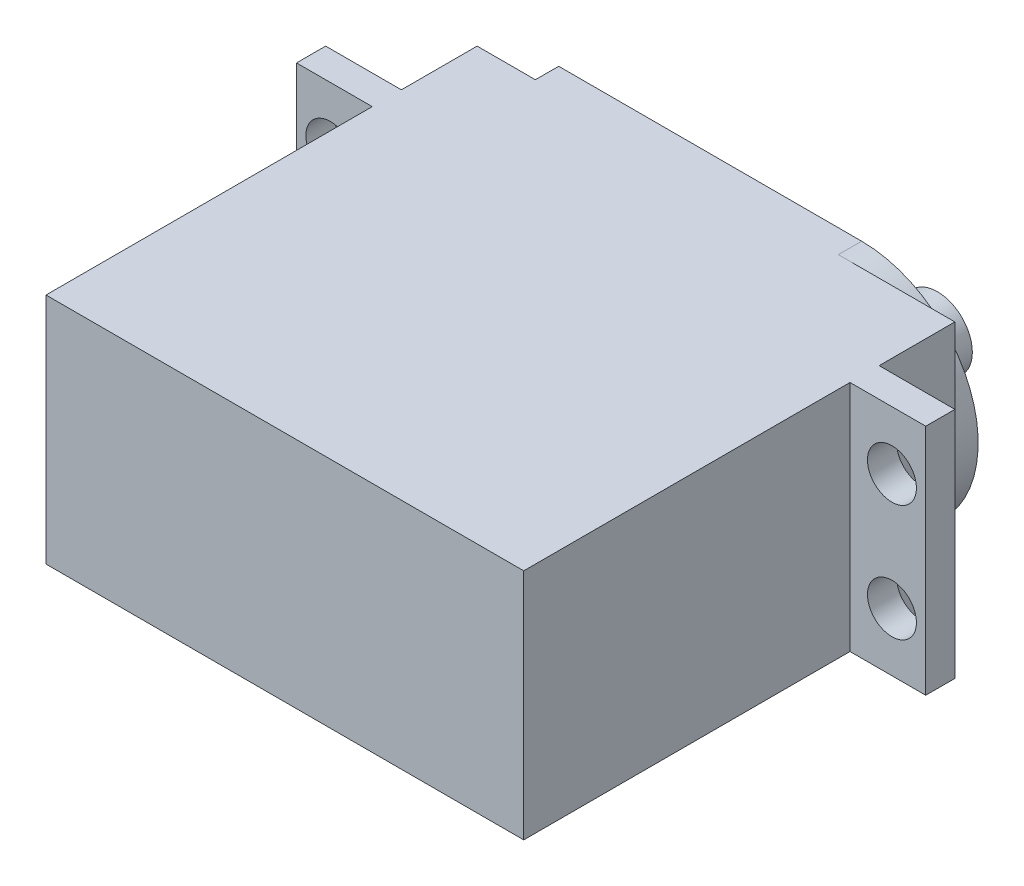
ISO-10303-21;
HEADER;
FILE_DESCRIPTION(('STEP AP214'),'2;1');
FILE_NAME('part.step','',(''),(''),'','','');
FILE_SCHEMA(('AUTOMOTIVE_DESIGN { 1 0 10303 214 1 1 1 1 }'));
ENDSEC;
DATA;
#1=APPLICATION_CONTEXT('core data for automotive mechanical design processes');
#2=APPLICATION_PROTOCOL_DEFINITION('international standard','automotive_design',2000,#1);
#3=PRODUCT_CONTEXT('',#1,'mechanical');
#4=PRODUCT('Part','Part','',(#3));
#5=PRODUCT_RELATED_PRODUCT_CATEGORY('part','',(#4));
#6=PRODUCT_DEFINITION_FORMATION('','',#4);
#7=PRODUCT_DEFINITION_CONTEXT('part definition',#1,'design');
#8=PRODUCT_DEFINITION('design','',#6,#7);
#9=PRODUCT_DEFINITION_SHAPE('','',#8);
#10=(LENGTH_UNIT() NAMED_UNIT(*) SI_UNIT(.MILLI.,.METRE.));
#11=(NAMED_UNIT(*) PLANE_ANGLE_UNIT() SI_UNIT($,.RADIAN.));
#12=(NAMED_UNIT(*) SI_UNIT($,.STERADIAN.) SOLID_ANGLE_UNIT());
#13=UNCERTAINTY_MEASURE_WITH_UNIT(LENGTH_MEASURE(1.E-05),#10,'distance_accuracy_value','');
#14=(GEOMETRIC_REPRESENTATION_CONTEXT(3) GLOBAL_UNCERTAINTY_ASSIGNED_CONTEXT((#13)) GLOBAL_UNIT_ASSIGNED_CONTEXT((#10,
#11,#12)) REPRESENTATION_CONTEXT('',''));
#15=CARTESIAN_POINT('',(0.,0.,0.));
#16=DIRECTION('',(0.,0.,1.));
#17=DIRECTION('',(1.,0.,0.));
#18=AXIS2_PLACEMENT_3D('',#15,#16,#17);
#19=CARTESIAN_POINT('',(10.5,-40.,-13.4999999999999));
#20=DIRECTION('',(0.,0.,1.));
#21=DIRECTION('',(1.,0.,0.));
#22=AXIS2_PLACEMENT_3D('',#19,#20,#21);
#23=PLANE('',#22);
#24=DIRECTION('',(1.,0.,0.));
#25=VECTOR('',#24,1.);
#26=CARTESIAN_POINT('',(10.5,-30.,-13.4999999999999));
#27=LINE('',#26,#25);
#28=CARTESIAN_POINT('',(10.5,-30.,-13.4999999999999));
#29=VERTEX_POINT('',#28);
#30=CARTESIAN_POINT('',(20.5,-30.,-13.4999999999999));
#31=VERTEX_POINT('',#30);
#32=EDGE_CURVE('E181',#29,#31,#27,.T.);
#33=ORIENTED_EDGE('',*,*,#32,.T.);
#34=DIRECTION('',(0.,-1.,0.));
#35=VECTOR('',#34,1.);
#36=CARTESIAN_POINT('',(20.5,-40.,-13.4999999999999));
#37=LINE('',#36,#35);
#38=CARTESIAN_POINT('',(20.5,-40.,-13.4999999999999));
#39=VERTEX_POINT('',#38);
#40=EDGE_CURVE('E40',#31,#39,#37,.T.);
#41=ORIENTED_EDGE('',*,*,#40,.T.);
#42=CARTESIAN_POINT('',(10.5,-40.,-13.4999999999999));
#43=DIRECTION('',(0.,0.,1.));
#44=DIRECTION('',(1.,0.,0.));
#45=AXIS2_PLACEMENT_3D('',#42,#43,#44);
#46=CIRCLE('',#45,10.);
#47=EDGE_CURVE('E182',#39,#29,#46,.T.);
#48=ORIENTED_EDGE('',*,*,#47,.T.);
#49=EDGE_LOOP('',(#33,#41,#48));
#50=FACE_BOUND('',#49,.T.);
#51=ADVANCED_FACE('F32',(#50),#23,.F.);
#52=CARTESIAN_POINT('',(0.,-30.,0.));
#53=DIRECTION('',(0.,-1.,0.));
#54=DIRECTION('',(0.,0.,-1.));
#55=AXIS2_PLACEMENT_3D('',#52,#53,#54);
#56=PLANE('',#55);
#57=DIRECTION('',(0.,0.,1.));
#58=VECTOR('',#57,1.);
#59=CARTESIAN_POINT('',(27.,-30.,-15.4999999999999));
#60=LINE('',#59,#58);
#61=CARTESIAN_POINT('',(27.,-30.,-6.99999999999995));
#62=VERTEX_POINT('',#61);
#63=CARTESIAN_POINT('',(27.,-30.,-4.49999999999995));
#64=VERTEX_POINT('',#63);
#65=EDGE_CURVE('E265',#62,#64,#60,.T.);
#66=ORIENTED_EDGE('',*,*,#65,.F.);
#67=DIRECTION('',(1.,0.,0.));
#68=VECTOR('',#67,1.);
#69=CARTESIAN_POINT('',(20.5,-30.,-6.99999999999995));
#70=LINE('',#69,#68);
#71=CARTESIAN_POINT('',(20.5,-30.,-6.99999999999995));
#72=VERTEX_POINT('',#71);
#73=EDGE_CURVE('E167',#72,#62,#70,.T.);
#74=ORIENTED_EDGE('',*,*,#73,.F.);
#75=DIRECTION('',(0.,0.,1.));
#76=VECTOR('',#75,1.);
#77=CARTESIAN_POINT('',(20.5,-30.,-13.4999999999999));
#78=LINE('',#77,#76);
#79=EDGE_CURVE('E150',#31,#72,#78,.T.);
#80=ORIENTED_EDGE('',*,*,#79,.F.);
#81=ORIENTED_EDGE('',*,*,#32,.F.);
#82=DIRECTION('',(0.,0.,-1.));
#83=VECTOR('',#82,1.);
#84=CARTESIAN_POINT('',(10.5,-30.,-13.4999999999999));
#85=LINE('',#84,#83);
#86=CARTESIAN_POINT('',(10.5,-30.,-15.4999999999999));
#87=VERTEX_POINT('',#86);
#88=EDGE_CURVE('E186',#29,#87,#85,.T.);
#89=ORIENTED_EDGE('',*,*,#88,.T.);
#90=DIRECTION('',(1.,0.,0.));
#91=VECTOR('',#90,1.);
#92=CARTESIAN_POINT('',(-27.,-30.,-15.4999999999999));
#93=LINE('',#92,#91);
#94=CARTESIAN_POINT('',(-15.5,-30.,-15.4999999999999));
#95=VERTEX_POINT('',#94);
#96=EDGE_CURVE('E262',#95,#87,#93,.T.);
#97=ORIENTED_EDGE('',*,*,#96,.F.);
#98=DIRECTION('',(0.,0.,-1.));
#99=VECTOR('',#98,1.);
#100=CARTESIAN_POINT('',(-15.5,-30.,-13.4999999999999));
#101=LINE('',#100,#99);
#102=CARTESIAN_POINT('',(-15.5,-30.,-13.4999999999999));
#103=VERTEX_POINT('',#102);
#104=EDGE_CURVE('E195',#103,#95,#101,.T.);
#105=ORIENTED_EDGE('',*,*,#104,.F.);
#106=DIRECTION('',(1.,0.,0.));
#107=VECTOR('',#106,1.);
#108=CARTESIAN_POINT('',(-20.5,-30.,-13.4999999999999));
#109=LINE('',#108,#107);
#110=CARTESIAN_POINT('',(-20.5,-30.,-13.4999999999999));
#111=VERTEX_POINT('',#110);
#112=EDGE_CURVE('E190',#111,#103,#109,.T.);
#113=ORIENTED_EDGE('',*,*,#112,.F.);
#114=DIRECTION('',(0.,0.,-1.));
#115=VECTOR('',#114,1.);
#116=CARTESIAN_POINT('',(-20.5,-30.,-6.99999999999995));
#117=LINE('',#116,#115);
#118=CARTESIAN_POINT('',(-20.5,-30.,-6.99999999999995));
#119=VERTEX_POINT('',#118);
#120=EDGE_CURVE('E213',#119,#111,#117,.T.);
#121=ORIENTED_EDGE('',*,*,#120,.F.);
#122=DIRECTION('',(1.,0.,0.));
#123=VECTOR('',#122,1.);
#124=CARTESIAN_POINT('',(-27.,-30.,-6.99999999999995));
#125=LINE('',#124,#123);
#126=CARTESIAN_POINT('',(-27.,-30.,-6.99999999999995));
#127=VERTEX_POINT('',#126);
#128=EDGE_CURVE('E205',#127,#119,#125,.T.);
#129=ORIENTED_EDGE('',*,*,#128,.F.);
#130=DIRECTION('',(0.,0.,-1.));
#131=VECTOR('',#130,1.);
#132=CARTESIAN_POINT('',(-27.,-30.,23.5000000000001));
#133=LINE('',#132,#131);
#134=CARTESIAN_POINT('',(-27.,-30.,-4.49999999999995));
#135=VERTEX_POINT('',#134);
#136=EDGE_CURVE('E271',#135,#127,#133,.T.);
#137=ORIENTED_EDGE('',*,*,#136,.F.);
#138=DIRECTION('',(-1.,0.,0.));
#139=VECTOR('',#138,1.);
#140=CARTESIAN_POINT('',(-20.5,-30.,-4.49999999999995));
#141=LINE('',#140,#139);
#142=CARTESIAN_POINT('',(-20.5,-30.,-4.49999999999995));
#143=VERTEX_POINT('',#142);
#144=EDGE_CURVE('E229',#143,#135,#141,.T.);
#145=ORIENTED_EDGE('',*,*,#144,.F.);
#146=DIRECTION('',(0.,0.,-1.));
#147=VECTOR('',#146,1.);
#148=CARTESIAN_POINT('',(-20.5,-30.,23.5000000000001));
#149=LINE('',#148,#147);
#150=CARTESIAN_POINT('',(-20.5,-30.,23.5000000000001));
#151=VERTEX_POINT('',#150);
#152=EDGE_CURVE('E223',#151,#143,#149,.T.);
#153=ORIENTED_EDGE('',*,*,#152,.F.);
#154=DIRECTION('',(-1.,0.,0.));
#155=VECTOR('',#154,1.);
#156=CARTESIAN_POINT('',(27.,-30.,23.5000000000001));
#157=LINE('',#156,#155);
#158=CARTESIAN_POINT('',(20.5,-30.,23.5000000000001));
#159=VERTEX_POINT('',#158);
#160=EDGE_CURVE('E268',#159,#151,#157,.T.);
#161=ORIENTED_EDGE('',*,*,#160,.F.);
#162=DIRECTION('',(0.,0.,1.));
#163=VECTOR('',#162,1.);
#164=CARTESIAN_POINT('',(20.5,-30.,-4.49999999999995));
#165=LINE('',#164,#163);
#166=CARTESIAN_POINT('',(20.5,-30.,-4.49999999999995));
#167=VERTEX_POINT('',#166);
#168=EDGE_CURVE('E247',#167,#159,#165,.T.);
#169=ORIENTED_EDGE('',*,*,#168,.F.);
#170=DIRECTION('',(-1.,0.,0.));
#171=VECTOR('',#170,1.);
#172=CARTESIAN_POINT('',(27.,-30.,-4.49999999999995));
#173=LINE('',#172,#171);
#174=EDGE_CURVE('E239',#64,#167,#173,.T.);
#175=ORIENTED_EDGE('',*,*,#174,.F.);
#176=EDGE_LOOP('',(#66,#74,#80,#81,#89,#97,#105,#113,#121,#129,#137,#145,#153,#161,#169,#175));
#177=FACE_BOUND('',#176,.T.);
#178=ADVANCED_FACE('F304',(#177),#56,.F.);
#179=CARTESIAN_POINT('',(0.,-50.,0.));
#180=DIRECTION('',(0.,-1.,0.));
#181=DIRECTION('',(0.,0.,-1.));
#182=AXIS2_PLACEMENT_3D('',#179,#180,#181);
#183=PLANE('',#182);
#184=DIRECTION('',(1.,0.,0.));
#185=VECTOR('',#184,1.);
#186=CARTESIAN_POINT('',(20.5,-50.,-6.99999999999995));
#187=LINE('',#186,#185);
#188=CARTESIAN_POINT('',(20.5,-50.,-6.99999999999995));
#189=VERTEX_POINT('',#188);
#190=CARTESIAN_POINT('',(27.,-50.,-6.99999999999995));
#191=VERTEX_POINT('',#190);
#192=EDGE_CURVE('E157',#189,#191,#187,.T.);
#193=ORIENTED_EDGE('',*,*,#192,.T.);
#194=DIRECTION('',(0.,0.,1.));
#195=VECTOR('',#194,1.);
#196=CARTESIAN_POINT('',(27.,-50.,-15.4999999999999));
#197=LINE('',#196,#195);
#198=CARTESIAN_POINT('',(27.,-50.,-4.49999999999995));
#199=VERTEX_POINT('',#198);
#200=EDGE_CURVE('E276',#191,#199,#197,.T.);
#201=ORIENTED_EDGE('',*,*,#200,.T.);
#202=DIRECTION('',(-1.,0.,0.));
#203=VECTOR('',#202,1.);
#204=CARTESIAN_POINT('',(27.,-50.,-4.49999999999995));
#205=LINE('',#204,#203);
#206=CARTESIAN_POINT('',(20.5,-50.,-4.49999999999995));
#207=VERTEX_POINT('',#206);
#208=EDGE_CURVE('E243',#199,#207,#205,.T.);
#209=ORIENTED_EDGE('',*,*,#208,.T.);
#210=DIRECTION('',(0.,0.,1.));
#211=VECTOR('',#210,1.);
#212=CARTESIAN_POINT('',(20.5,-50.,-4.49999999999995));
#213=LINE('',#212,#211);
#214=CARTESIAN_POINT('',(20.5,-50.,23.5000000000001));
#215=VERTEX_POINT('',#214);
#216=EDGE_CURVE('E246',#207,#215,#213,.T.);
#217=ORIENTED_EDGE('',*,*,#216,.T.);
#218=DIRECTION('',(-1.,0.,0.));
#219=VECTOR('',#218,1.);
#220=CARTESIAN_POINT('',(27.,-50.,23.5000000000001));
#221=LINE('',#220,#219);
#222=CARTESIAN_POINT('',(-20.5,-50.,23.5000000000001));
#223=VERTEX_POINT('',#222);
#224=EDGE_CURVE('E278',#215,#223,#221,.T.);
#225=ORIENTED_EDGE('',*,*,#224,.T.);
#226=DIRECTION('',(0.,0.,-1.));
#227=VECTOR('',#226,1.);
#228=CARTESIAN_POINT('',(-20.5,-50.,23.5000000000001));
#229=LINE('',#228,#227);
#230=CARTESIAN_POINT('',(-20.5,-50.,-4.49999999999995));
#231=VERTEX_POINT('',#230);
#232=EDGE_CURVE('E225',#223,#231,#229,.T.);
#233=ORIENTED_EDGE('',*,*,#232,.T.);
#234=DIRECTION('',(-1.,0.,0.));
#235=VECTOR('',#234,1.);
#236=CARTESIAN_POINT('',(-20.5,-50.,-4.49999999999995));
#237=LINE('',#236,#235);
#238=CARTESIAN_POINT('',(-27.,-50.,-4.49999999999995));
#239=VERTEX_POINT('',#238);
#240=EDGE_CURVE('E228',#231,#239,#237,.T.);
#241=ORIENTED_EDGE('',*,*,#240,.T.);
#242=DIRECTION('',(0.,0.,-1.));
#243=VECTOR('',#242,1.);
#244=CARTESIAN_POINT('',(-27.,-50.,23.5000000000001));
#245=LINE('',#244,#243);
#246=CARTESIAN_POINT('',(-27.,-50.,-6.99999999999995));
#247=VERTEX_POINT('',#246);
#248=EDGE_CURVE('E266',#239,#247,#245,.T.);
#249=ORIENTED_EDGE('',*,*,#248,.T.);
#250=DIRECTION('',(1.,0.,0.));
#251=VECTOR('',#250,1.);
#252=CARTESIAN_POINT('',(-27.,-50.,-6.99999999999995));
#253=LINE('',#252,#251);
#254=CARTESIAN_POINT('',(-20.5,-50.,-6.99999999999995));
#255=VERTEX_POINT('',#254);
#256=EDGE_CURVE('E209',#247,#255,#253,.T.);
#257=ORIENTED_EDGE('',*,*,#256,.T.);
#258=DIRECTION('',(0.,0.,-1.));
#259=VECTOR('',#258,1.);
#260=CARTESIAN_POINT('',(-20.5,-50.,-6.99999999999995));
#261=LINE('',#260,#259);
#262=CARTESIAN_POINT('',(-20.5,-50.,-13.4999999999999));
#263=VERTEX_POINT('',#262);
#264=EDGE_CURVE('E212',#255,#263,#261,.T.);
#265=ORIENTED_EDGE('',*,*,#264,.T.);
#266=DIRECTION('',(1.,0.,0.));
#267=VECTOR('',#266,1.);
#268=CARTESIAN_POINT('',(-20.5,-50.,-13.4999999999999));
#269=LINE('',#268,#267);
#270=CARTESIAN_POINT('',(-15.5,-50.,-13.4999999999999));
#271=VERTEX_POINT('',#270);
#272=EDGE_CURVE('E55',#263,#271,#269,.T.);
#273=ORIENTED_EDGE('',*,*,#272,.T.);
#274=DIRECTION('',(0.,0.,-1.));
#275=VECTOR('',#274,1.);
#276=CARTESIAN_POINT('',(-15.5,-50.,-13.4999999999999));
#277=LINE('',#276,#275);
#278=CARTESIAN_POINT('',(-15.5,-50.,-15.4999999999999));
#279=VERTEX_POINT('',#278);
#280=EDGE_CURVE('E194',#271,#279,#277,.T.);
#281=ORIENTED_EDGE('',*,*,#280,.T.);
#282=DIRECTION('',(1.,0.,0.));
#283=VECTOR('',#282,1.);
#284=CARTESIAN_POINT('',(-27.,-50.,-15.4999999999999));
#285=LINE('',#284,#283);
#286=CARTESIAN_POINT('',(10.5,-50.,-15.4999999999999));
#287=VERTEX_POINT('',#286);
#288=EDGE_CURVE('E257',#279,#287,#285,.T.);
#289=ORIENTED_EDGE('',*,*,#288,.T.);
#290=DIRECTION('',(0.,0.,-1.));
#291=VECTOR('',#290,1.);
#292=CARTESIAN_POINT('',(10.5,-50.,-13.4999999999999));
#293=LINE('',#292,#291);
#294=CARTESIAN_POINT('',(10.5,-50.,-13.4999999999999));
#295=VERTEX_POINT('',#294);
#296=EDGE_CURVE('E188',#295,#287,#293,.T.);
#297=ORIENTED_EDGE('',*,*,#296,.F.);
#298=DIRECTION('',(-1.,0.,0.));
#299=VECTOR('',#298,1.);
#300=CARTESIAN_POINT('',(27.,-50.,-13.4999999999999));
#301=LINE('',#300,#299);
#302=CARTESIAN_POINT('',(20.5,-50.,-13.4999999999999));
#303=VERTEX_POINT('',#302);
#304=EDGE_CURVE('E166',#303,#295,#301,.T.);
#305=ORIENTED_EDGE('',*,*,#304,.F.);
#306=DIRECTION('',(0.,0.,1.));
#307=VECTOR('',#306,1.);
#308=CARTESIAN_POINT('',(20.5,-50.,-13.4999999999999));
#309=LINE('',#308,#307);
#310=EDGE_CURVE('E47',#303,#189,#309,.T.);
#311=ORIENTED_EDGE('',*,*,#310,.T.);
#312=EDGE_LOOP('',(#193,#201,#209,#217,#225,#233,#241,#249,#257,#265,#273,#281,#289,#297,#305,#311));
#313=FACE_BOUND('',#312,.T.);
#314=ADVANCED_FACE('F164',(#313),#183,.T.);
#315=CARTESIAN_POINT('',(-27.,-30.,-15.4999999999999));
#316=DIRECTION('',(0.,0.,-1.));
#317=DIRECTION('',(-1.,0.,0.));
#318=AXIS2_PLACEMENT_3D('',#315,#316,#317);
#319=PLANE('',#318);
#320=CARTESIAN_POINT('',(10.5,-40.,-15.4999999999999));
#321=DIRECTION('',(0.,0.,-1.));
#322=DIRECTION('',(-1.,0.,0.));
#323=AXIS2_PLACEMENT_3D('',#320,#321,#322);
#324=CIRCLE('',#323,6.5);
#325=CARTESIAN_POINT('',(4.,-40.,-15.4999999999999));
#326=VERTEX_POINT('',#325);
#327=EDGE_CURVE('E11',#326,#326,#324,.T.);
#328=ORIENTED_EDGE('',*,*,#327,.F.);
#329=EDGE_LOOP('',(#328));
#330=FACE_BOUND('',#329,.T.);
#331=CARTESIAN_POINT('',(10.5,-40.,-15.4999999999999));
#332=DIRECTION('',(0.,0.,1.));
#333=DIRECTION('',(1.,0.,0.));
#334=AXIS2_PLACEMENT_3D('',#331,#332,#333);
#335=CIRCLE('',#334,10.);
#336=EDGE_CURVE('E175',#287,#87,#335,.T.);
#337=ORIENTED_EDGE('',*,*,#336,.F.);
#338=ORIENTED_EDGE('',*,*,#288,.F.);
#339=DIRECTION('',(0.,1.,0.));
#340=VECTOR('',#339,1.);
#341=CARTESIAN_POINT('',(-15.5,-50.,-15.4999999999999));
#342=LINE('',#341,#340);
#343=EDGE_CURVE('E202',#279,#95,#342,.T.);
#344=ORIENTED_EDGE('',*,*,#343,.T.);
#345=ORIENTED_EDGE('',*,*,#96,.T.);
#346=EDGE_LOOP('',(#337,#338,#344,#345));
#347=FACE_BOUND('',#346,.T.);
#348=ADVANCED_FACE('F34',(#330,#347),#319,.T.);
#349=CARTESIAN_POINT('',(-27.,-30.,23.5000000000001));
#350=DIRECTION('',(-1.,0.,0.));
#351=DIRECTION('',(0.,0.,1.));
#352=AXIS2_PLACEMENT_3D('',#349,#350,#351);
#353=PLANE('',#352);
#354=DIRECTION('',(0.,1.,0.));
#355=VECTOR('',#354,1.);
#356=CARTESIAN_POINT('',(-27.,-50.,-6.99999999999995));
#357=LINE('',#356,#355);
#358=EDGE_CURVE('E216',#247,#127,#357,.T.);
#359=ORIENTED_EDGE('',*,*,#358,.F.);
#360=ORIENTED_EDGE('',*,*,#248,.F.);
#361=DIRECTION('',(0.,1.,0.));
#362=VECTOR('',#361,1.);
#363=CARTESIAN_POINT('',(-27.,-50.,-4.49999999999995));
#364=LINE('',#363,#362);
#365=EDGE_CURVE('E236',#239,#135,#364,.T.);
#366=ORIENTED_EDGE('',*,*,#365,.T.);
#367=ORIENTED_EDGE('',*,*,#136,.T.);
#368=EDGE_LOOP('',(#359,#360,#366,#367));
#369=FACE_BOUND('',#368,.T.);
#370=ADVANCED_FACE('F319',(#369),#353,.T.);
#371=CARTESIAN_POINT('',(27.,-30.,23.5000000000001));
#372=DIRECTION('',(0.,0.,1.));
#373=DIRECTION('',(1.,0.,0.));
#374=AXIS2_PLACEMENT_3D('',#371,#372,#373);
#375=PLANE('',#374);
#376=DIRECTION('',(0.,1.,0.));
#377=VECTOR('',#376,1.);
#378=CARTESIAN_POINT('',(-20.5,-50.,23.5000000000001));
#379=LINE('',#378,#377);
#380=EDGE_CURVE('E232',#223,#151,#379,.T.);
#381=ORIENTED_EDGE('',*,*,#380,.F.);
#382=ORIENTED_EDGE('',*,*,#224,.F.);
#383=DIRECTION('',(0.,1.,0.));
#384=VECTOR('',#383,1.);
#385=CARTESIAN_POINT('',(20.5,-50.,23.5000000000001));
#386=LINE('',#385,#384);
#387=EDGE_CURVE('E254',#215,#159,#386,.T.);
#388=ORIENTED_EDGE('',*,*,#387,.T.);
#389=ORIENTED_EDGE('',*,*,#160,.T.);
#390=EDGE_LOOP('',(#381,#382,#388,#389));
#391=FACE_BOUND('',#390,.T.);
#392=ADVANCED_FACE('F322',(#391),#375,.T.);
#393=CARTESIAN_POINT('',(27.,-30.,-15.4999999999999));
#394=DIRECTION('',(1.,0.,0.));
#395=DIRECTION('',(0.,0.,-1.));
#396=AXIS2_PLACEMENT_3D('',#393,#394,#395);
#397=PLANE('',#396);
#398=DIRECTION('',(0.,1.,0.));
#399=VECTOR('',#398,1.);
#400=CARTESIAN_POINT('',(27.,-50.,-6.99999999999995));
#401=LINE('',#400,#399);
#402=EDGE_CURVE('E153',#191,#62,#401,.T.);
#403=ORIENTED_EDGE('',*,*,#402,.T.);
#404=ORIENTED_EDGE('',*,*,#65,.T.);
#405=DIRECTION('',(0.,1.,0.));
#406=VECTOR('',#405,1.);
#407=CARTESIAN_POINT('',(27.,-50.,-4.49999999999995));
#408=LINE('',#407,#406);
#409=EDGE_CURVE('E250',#199,#64,#408,.T.);
#410=ORIENTED_EDGE('',*,*,#409,.F.);
#411=ORIENTED_EDGE('',*,*,#200,.F.);
#412=EDGE_LOOP('',(#403,#404,#410,#411));
#413=FACE_BOUND('',#412,.T.);
#414=ADVANCED_FACE('F325',(#413),#397,.T.);
#415=CARTESIAN_POINT('',(20.5,-50.,-4.49999999999995));
#416=DIRECTION('',(-1.,0.,0.));
#417=DIRECTION('',(0.,0.,1.));
#418=AXIS2_PLACEMENT_3D('',#415,#416,#417);
#419=PLANE('',#418);
#420=ORIENTED_EDGE('',*,*,#168,.T.);
#421=ORIENTED_EDGE('',*,*,#387,.F.);
#422=ORIENTED_EDGE('',*,*,#216,.F.);
#423=DIRECTION('',(0.,1.,0.));
#424=VECTOR('',#423,1.);
#425=CARTESIAN_POINT('',(20.5,-50.,-4.49999999999995));
#426=LINE('',#425,#424);
#427=EDGE_CURVE('E258',#207,#167,#426,.T.);
#428=ORIENTED_EDGE('',*,*,#427,.T.);
#429=EDGE_LOOP('',(#420,#421,#422,#428));
#430=FACE_BOUND('',#429,.T.);
#431=ADVANCED_FACE('F328',(#430),#419,.F.);
#432=CARTESIAN_POINT('',(27.,-50.,-4.49999999999995));
#433=DIRECTION('',(0.,0.,-1.));
#434=DIRECTION('',(-1.,0.,0.));
#435=AXIS2_PLACEMENT_3D('',#432,#433,#434);
#436=PLANE('',#435);
#437=CARTESIAN_POINT('',(24.1,-45.,-4.49999999999995));
#438=DIRECTION('',(0.,0.,-1.));
#439=DIRECTION('',(-1.,0.,0.));
#440=AXIS2_PLACEMENT_3D('',#437,#438,#439);
#441=CIRCLE('',#440,2.09999999999999);
#442=CARTESIAN_POINT('',(22.,-45.,-4.49999999999995));
#443=VERTEX_POINT('',#442);
#444=EDGE_CURVE('E518',#443,#443,#441,.T.);
#445=ORIENTED_EDGE('',*,*,#444,.T.);
#446=EDGE_LOOP('',(#445));
#447=FACE_BOUND('',#446,.T.);
#448=CARTESIAN_POINT('',(24.1,-35.,-4.49999999999995));
#449=DIRECTION('',(0.,0.,-1.));
#450=DIRECTION('',(-1.,0.,0.));
#451=AXIS2_PLACEMENT_3D('',#448,#449,#450);
#452=CIRCLE('',#451,2.09999999999999);
#453=CARTESIAN_POINT('',(22.,-35.,-4.49999999999995));
#454=VERTEX_POINT('',#453);
#455=EDGE_CURVE('E524',#454,#454,#452,.T.);
#456=ORIENTED_EDGE('',*,*,#455,.T.);
#457=EDGE_LOOP('',(#456));
#458=FACE_BOUND('',#457,.T.);
#459=ORIENTED_EDGE('',*,*,#174,.T.);
#460=ORIENTED_EDGE('',*,*,#427,.F.);
#461=ORIENTED_EDGE('',*,*,#208,.F.);
#462=ORIENTED_EDGE('',*,*,#409,.T.);
#463=EDGE_LOOP('',(#459,#460,#461,#462));
#464=FACE_BOUND('',#463,.T.);
#465=ADVANCED_FACE('F316',(#447,#458,#464),#436,.F.);
#466=CARTESIAN_POINT('',(-20.5,-50.,-4.49999999999995));
#467=DIRECTION('',(0.,0.,-1.));
#468=DIRECTION('',(-1.,0.,0.));
#469=AXIS2_PLACEMENT_3D('',#466,#467,#468);
#470=PLANE('',#469);
#471=CARTESIAN_POINT('',(-24.1,-45.,-4.49999999999995));
#472=DIRECTION('',(0.,0.,-1.));
#473=DIRECTION('',(-1.,0.,0.));
#474=AXIS2_PLACEMENT_3D('',#471,#472,#473);
#475=CIRCLE('',#474,2.09999999999999);
#476=CARTESIAN_POINT('',(-26.2,-45.,-4.49999999999995));
#477=VERTEX_POINT('',#476);
#478=EDGE_CURVE('E505',#477,#477,#475,.T.);
#479=ORIENTED_EDGE('',*,*,#478,.T.);
#480=EDGE_LOOP('',(#479));
#481=FACE_BOUND('',#480,.T.);
#482=CARTESIAN_POINT('',(-24.1,-35.,-4.49999999999995));
#483=DIRECTION('',(0.,0.,-1.));
#484=DIRECTION('',(-1.,0.,0.));
#485=AXIS2_PLACEMENT_3D('',#482,#483,#484);
#486=CIRCLE('',#485,2.09999999999999);
#487=CARTESIAN_POINT('',(-26.2,-35.,-4.49999999999995));
#488=VERTEX_POINT('',#487);
#489=EDGE_CURVE('E509',#488,#488,#486,.T.);
#490=ORIENTED_EDGE('',*,*,#489,.T.);
#491=EDGE_LOOP('',(#490));
#492=FACE_BOUND('',#491,.T.);
#493=ORIENTED_EDGE('',*,*,#144,.T.);
#494=ORIENTED_EDGE('',*,*,#365,.F.);
#495=ORIENTED_EDGE('',*,*,#240,.F.);
#496=DIRECTION('',(0.,1.,0.));
#497=VECTOR('',#496,1.);
#498=CARTESIAN_POINT('',(-20.5,-50.,-4.49999999999995));
#499=LINE('',#498,#497);
#500=EDGE_CURVE('E240',#231,#143,#499,.T.);
#501=ORIENTED_EDGE('',*,*,#500,.T.);
#502=EDGE_LOOP('',(#493,#494,#495,#501));
#503=FACE_BOUND('',#502,.T.);
#504=ADVANCED_FACE('F351',(#481,#492,#503),#470,.F.);
#505=CARTESIAN_POINT('',(-20.5,-50.,23.5000000000001));
#506=DIRECTION('',(1.,0.,0.));
#507=DIRECTION('',(0.,0.,-1.));
#508=AXIS2_PLACEMENT_3D('',#505,#506,#507);
#509=PLANE('',#508);
#510=ORIENTED_EDGE('',*,*,#152,.T.);
#511=ORIENTED_EDGE('',*,*,#500,.F.);
#512=ORIENTED_EDGE('',*,*,#232,.F.);
#513=ORIENTED_EDGE('',*,*,#380,.T.);
#514=EDGE_LOOP('',(#510,#511,#512,#513));
#515=FACE_BOUND('',#514,.T.);
#516=ADVANCED_FACE('F345',(#515),#509,.F.);
#517=CARTESIAN_POINT('',(-20.5,-50.,-6.99999999999995));
#518=DIRECTION('',(1.,0.,0.));
#519=DIRECTION('',(0.,0.,-1.));
#520=AXIS2_PLACEMENT_3D('',#517,#518,#519);
#521=PLANE('',#520);
#522=ORIENTED_EDGE('',*,*,#120,.T.);
#523=DIRECTION('',(0.,1.,0.));
#524=VECTOR('',#523,1.);
#525=CARTESIAN_POINT('',(-20.5,-50.,-13.4999999999999));
#526=LINE('',#525,#524);
#527=EDGE_CURVE('E198',#263,#111,#526,.T.);
#528=ORIENTED_EDGE('',*,*,#527,.F.);
#529=ORIENTED_EDGE('',*,*,#264,.F.);
#530=DIRECTION('',(0.,1.,0.));
#531=VECTOR('',#530,1.);
#532=CARTESIAN_POINT('',(-20.5,-50.,-6.99999999999995));
#533=LINE('',#532,#531);
#534=EDGE_CURVE('E221',#255,#119,#533,.T.);
#535=ORIENTED_EDGE('',*,*,#534,.T.);
#536=EDGE_LOOP('',(#522,#528,#529,#535));
#537=FACE_BOUND('',#536,.T.);
#538=ADVANCED_FACE('F359',(#537),#521,.F.);
#539=CARTESIAN_POINT('',(-27.,-50.,-6.99999999999995));
#540=DIRECTION('',(0.,0.,1.));
#541=DIRECTION('',(1.,0.,0.));
#542=AXIS2_PLACEMENT_3D('',#539,#540,#541);
#543=PLANE('',#542);
#544=CARTESIAN_POINT('',(-24.1,-45.,-6.99999999999995));
#545=DIRECTION('',(0.,0.,-1.));
#546=DIRECTION('',(-1.,0.,0.));
#547=AXIS2_PLACEMENT_3D('',#544,#545,#546);
#548=CIRCLE('',#547,2.09999999999999);
#549=CARTESIAN_POINT('',(-26.2,-45.,-6.99999999999995));
#550=VERTEX_POINT('',#549);
#551=EDGE_CURVE('E502',#550,#550,#548,.T.);
#552=ORIENTED_EDGE('',*,*,#551,.F.);
#553=EDGE_LOOP('',(#552));
#554=FACE_BOUND('',#553,.T.);
#555=CARTESIAN_POINT('',(-24.1,-35.,-6.99999999999995));
#556=DIRECTION('',(0.,0.,-1.));
#557=DIRECTION('',(-1.,0.,0.));
#558=AXIS2_PLACEMENT_3D('',#555,#556,#557);
#559=CIRCLE('',#558,2.09999999999999);
#560=CARTESIAN_POINT('',(-26.2,-35.,-6.99999999999995));
#561=VERTEX_POINT('',#560);
#562=EDGE_CURVE('E506',#561,#561,#559,.T.);
#563=ORIENTED_EDGE('',*,*,#562,.F.);
#564=EDGE_LOOP('',(#563));
#565=FACE_BOUND('',#564,.T.);
#566=ORIENTED_EDGE('',*,*,#128,.T.);
#567=ORIENTED_EDGE('',*,*,#534,.F.);
#568=ORIENTED_EDGE('',*,*,#256,.F.);
#569=ORIENTED_EDGE('',*,*,#358,.T.);
#570=EDGE_LOOP('',(#566,#567,#568,#569));
#571=FACE_BOUND('',#570,.T.);
#572=ADVANCED_FACE('F356',(#554,#565,#571),#543,.F.);
#573=CARTESIAN_POINT('',(-15.5,-50.,-13.4999999999999));
#574=DIRECTION('',(1.,0.,0.));
#575=DIRECTION('',(0.,0.,-1.));
#576=AXIS2_PLACEMENT_3D('',#573,#574,#575);
#577=PLANE('',#576);
#578=ORIENTED_EDGE('',*,*,#104,.T.);
#579=ORIENTED_EDGE('',*,*,#343,.F.);
#580=ORIENTED_EDGE('',*,*,#280,.F.);
#581=DIRECTION('',(0.,1.,0.));
#582=VECTOR('',#581,1.);
#583=CARTESIAN_POINT('',(-15.5,-50.,-13.4999999999999));
#584=LINE('',#583,#582);
#585=EDGE_CURVE('E206',#271,#103,#584,.T.);
#586=ORIENTED_EDGE('',*,*,#585,.T.);
#587=EDGE_LOOP('',(#578,#579,#580,#586));
#588=FACE_BOUND('',#587,.T.);
#589=ADVANCED_FACE('F364',(#588),#577,.F.);
#590=CARTESIAN_POINT('',(-20.5,-50.,-13.4999999999999));
#591=DIRECTION('',(0.,0.,1.));
#592=DIRECTION('',(1.,0.,0.));
#593=AXIS2_PLACEMENT_3D('',#590,#591,#592);
#594=PLANE('',#593);
#595=ORIENTED_EDGE('',*,*,#112,.T.);
#596=ORIENTED_EDGE('',*,*,#585,.F.);
#597=ORIENTED_EDGE('',*,*,#272,.F.);
#598=ORIENTED_EDGE('',*,*,#527,.T.);
#599=EDGE_LOOP('',(#595,#596,#597,#598));
#600=FACE_BOUND('',#599,.T.);
#601=ADVANCED_FACE('F300',(#600),#594,.F.);
#602=CARTESIAN_POINT('',(10.5,-40.,-13.4999999999999));
#603=DIRECTION('',(0.,0.,-1.));
#604=DIRECTION('',(-1.,0.,0.));
#605=AXIS2_PLACEMENT_3D('',#602,#603,#604);
#606=CYLINDRICAL_SURFACE('',#605,10.);
#607=ORIENTED_EDGE('',*,*,#336,.T.);
#608=ORIENTED_EDGE('',*,*,#88,.F.);
#609=ORIENTED_EDGE('',*,*,#47,.F.);
#610=EDGE_CURVE('E178',#295,#39,#46,.T.);
#611=ORIENTED_EDGE('',*,*,#610,.F.);
#612=ORIENTED_EDGE('',*,*,#296,.T.);
#613=EDGE_LOOP('',(#607,#608,#609,#611,#612));
#614=FACE_BOUND('',#613,.T.);
#615=ADVANCED_FACE('F289',(#614),#606,.T.);
#616=ORIENTED_EDGE('',*,*,#610,.T.);
#617=DIRECTION('',(0.,1.,0.));
#618=VECTOR('',#617,1.);
#619=CARTESIAN_POINT('',(20.5,-50.,-13.4999999999999));
#620=LINE('',#619,#618);
#621=EDGE_CURVE('E154',#303,#39,#620,.T.);
#622=ORIENTED_EDGE('',*,*,#621,.F.);
#623=ORIENTED_EDGE('',*,*,#304,.T.);
#624=EDGE_LOOP('',(#616,#622,#623));
#625=FACE_BOUND('',#624,.T.);
#626=ADVANCED_FACE('F291',(#625),#23,.F.);
#627=CARTESIAN_POINT('',(20.5,-50.,-6.99999999999995));
#628=DIRECTION('',(0.,0.,1.));
#629=DIRECTION('',(1.,0.,0.));
#630=AXIS2_PLACEMENT_3D('',#627,#628,#629);
#631=PLANE('',#630);
#632=CARTESIAN_POINT('',(24.1,-45.,-6.99999999999995));
#633=DIRECTION('',(0.,0.,-1.));
#634=DIRECTION('',(-1.,0.,0.));
#635=AXIS2_PLACEMENT_3D('',#632,#633,#634);
#636=CIRCLE('',#635,2.09999999999999);
#637=CARTESIAN_POINT('',(22.,-45.,-6.99999999999995));
#638=VERTEX_POINT('',#637);
#639=EDGE_CURVE('E515',#638,#638,#636,.T.);
#640=ORIENTED_EDGE('',*,*,#639,.F.);
#641=EDGE_LOOP('',(#640));
#642=FACE_BOUND('',#641,.T.);
#643=CARTESIAN_POINT('',(24.1,-35.,-6.99999999999995));
#644=DIRECTION('',(0.,0.,-1.));
#645=DIRECTION('',(-1.,0.,0.));
#646=AXIS2_PLACEMENT_3D('',#643,#644,#645);
#647=CIRCLE('',#646,2.09999999999999);
#648=CARTESIAN_POINT('',(22.,-35.,-6.99999999999995));
#649=VERTEX_POINT('',#648);
#650=EDGE_CURVE('E521',#649,#649,#647,.T.);
#651=ORIENTED_EDGE('',*,*,#650,.F.);
#652=EDGE_LOOP('',(#651));
#653=FACE_BOUND('',#652,.T.);
#654=ORIENTED_EDGE('',*,*,#73,.T.);
#655=ORIENTED_EDGE('',*,*,#402,.F.);
#656=ORIENTED_EDGE('',*,*,#192,.F.);
#657=DIRECTION('',(0.,1.,0.));
#658=VECTOR('',#657,1.);
#659=CARTESIAN_POINT('',(20.5,-50.,-6.99999999999995));
#660=LINE('',#659,#658);
#661=EDGE_CURVE('E146',#189,#72,#660,.T.);
#662=ORIENTED_EDGE('',*,*,#661,.T.);
#663=EDGE_LOOP('',(#654,#655,#656,#662));
#664=FACE_BOUND('',#663,.T.);
#665=ADVANCED_FACE('F158',(#642,#653,#664),#631,.F.);
#666=CARTESIAN_POINT('',(20.5,-50.,-13.4999999999999));
#667=DIRECTION('',(-1.,0.,0.));
#668=DIRECTION('',(0.,0.,1.));
#669=AXIS2_PLACEMENT_3D('',#666,#667,#668);
#670=PLANE('',#669);
#671=ORIENTED_EDGE('',*,*,#79,.T.);
#672=ORIENTED_EDGE('',*,*,#661,.F.);
#673=ORIENTED_EDGE('',*,*,#310,.F.);
#674=ORIENTED_EDGE('',*,*,#621,.T.);
#675=ORIENTED_EDGE('',*,*,#40,.F.);
#676=EDGE_LOOP('',(#671,#672,#673,#674,#675));
#677=FACE_BOUND('',#676,.T.);
#678=ADVANCED_FACE('F148',(#677),#670,.F.);
#679=CARTESIAN_POINT('',(10.5,-40.,-21.9999999999999));
#680=DIRECTION('',(0.,0.,1.));
#681=DIRECTION('',(1.,0.,0.));
#682=AXIS2_PLACEMENT_3D('',#679,#680,#681);
#683=CYLINDRICAL_SURFACE('',#682,3.);
#684=CARTESIAN_POINT('',(10.5,-40.,-21.9999999999999));
#685=DIRECTION('',(0.,0.,1.));
#686=DIRECTION('',(1.,0.,0.));
#687=AXIS2_PLACEMENT_3D('',#684,#685,#686);
#688=CIRCLE('',#687,3.);
#689=CARTESIAN_POINT('',(13.5,-40.,-21.9999999999999));
#690=VERTEX_POINT('',#689);
#691=EDGE_CURVE('E171',#690,#690,#688,.T.);
#692=ORIENTED_EDGE('',*,*,#691,.T.);
#693=EDGE_LOOP('',(#692));
#694=FACE_BOUND('',#693,.T.);
#695=CARTESIAN_POINT('',(10.5,-40.,-16.9999999999999));
#696=DIRECTION('',(0.,0.,1.));
#697=DIRECTION('',(1.,0.,0.));
#698=AXIS2_PLACEMENT_3D('',#695,#696,#697);
#699=CIRCLE('',#698,3.);
#700=CARTESIAN_POINT('',(13.5,-40.,-16.9999999999999));
#701=VERTEX_POINT('',#700);
#702=EDGE_CURVE('E527',#701,#701,#699,.T.);
#703=ORIENTED_EDGE('',*,*,#702,.F.);
#704=EDGE_LOOP('',(#703));
#705=FACE_BOUND('',#704,.T.);
#706=ADVANCED_FACE('F388',(#694,#705),#683,.T.);
#707=CARTESIAN_POINT('',(13.5,-40.,-21.9999999999999));
#708=DIRECTION('',(0.,0.,-1.));
#709=DIRECTION('',(-1.,0.,0.));
#710=AXIS2_PLACEMENT_3D('',#707,#708,#709);
#711=PLANE('',#710);
#712=ORIENTED_EDGE('',*,*,#691,.F.);
#713=EDGE_LOOP('',(#712));
#714=FACE_BOUND('',#713,.T.);
#715=ADVANCED_FACE('F378',(#714),#711,.T.);
#716=CARTESIAN_POINT('',(10.5,-40.,-21.9999999999999));
#717=DIRECTION('',(0.,0.,1.));
#718=DIRECTION('',(1.,0.,0.));
#719=AXIS2_PLACEMENT_3D('',#716,#717,#718);
#720=CYLINDRICAL_SURFACE('',#719,6.5);
#721=CARTESIAN_POINT('',(10.5,-40.,-16.9999999999999));
#722=DIRECTION('',(0.,0.,1.));
#723=DIRECTION('',(1.,0.,0.));
#724=AXIS2_PLACEMENT_3D('',#721,#722,#723);
#725=CIRCLE('',#724,6.5);
#726=CARTESIAN_POINT('',(17.,-40.,-16.9999999999999));
#727=VERTEX_POINT('',#726);
#728=EDGE_CURVE('E529',#727,#727,#725,.T.);
#729=ORIENTED_EDGE('',*,*,#728,.T.);
#730=EDGE_LOOP('',(#729));
#731=FACE_BOUND('',#730,.T.);
#732=ORIENTED_EDGE('',*,*,#327,.T.);
#733=EDGE_LOOP('',(#732));
#734=FACE_BOUND('',#733,.T.);
#735=ADVANCED_FACE('F375',(#731,#734),#720,.T.);
#736=CARTESIAN_POINT('',(17.,-40.,-16.9999999999999));
#737=DIRECTION('',(0.,0.,-1.));
#738=DIRECTION('',(-1.,0.,0.));
#739=AXIS2_PLACEMENT_3D('',#736,#737,#738);
#740=PLANE('',#739);
#741=ORIENTED_EDGE('',*,*,#702,.T.);
#742=EDGE_LOOP('',(#741));
#743=FACE_BOUND('',#742,.T.);
#744=ORIENTED_EDGE('',*,*,#728,.F.);
#745=EDGE_LOOP('',(#744));
#746=FACE_BOUND('',#745,.T.);
#747=ADVANCED_FACE('F377',(#743,#746),#740,.T.);
#748=CARTESIAN_POINT('',(24.1,-35.,-6.99999999999995));
#749=DIRECTION('',(0.,0.,-1.));
#750=DIRECTION('',(-1.,0.,0.));
#751=AXIS2_PLACEMENT_3D('',#748,#749,#750);
#752=CYLINDRICAL_SURFACE('',#751,2.09999999999999);
#753=ORIENTED_EDGE('',*,*,#650,.T.);
#754=EDGE_LOOP('',(#753));
#755=FACE_BOUND('',#754,.T.);
#756=ORIENTED_EDGE('',*,*,#455,.F.);
#757=EDGE_LOOP('',(#756));
#758=FACE_BOUND('',#757,.T.);
#759=ADVANCED_FACE('F385',(#755,#758),#752,.F.);
#760=CARTESIAN_POINT('',(24.1,-45.,-6.99999999999995));
#761=DIRECTION('',(0.,0.,-1.));
#762=DIRECTION('',(-1.,0.,0.));
#763=AXIS2_PLACEMENT_3D('',#760,#761,#762);
#764=CYLINDRICAL_SURFACE('',#763,2.09999999999999);
#765=ORIENTED_EDGE('',*,*,#639,.T.);
#766=EDGE_LOOP('',(#765));
#767=FACE_BOUND('',#766,.T.);
#768=ORIENTED_EDGE('',*,*,#444,.F.);
#769=EDGE_LOOP('',(#768));
#770=FACE_BOUND('',#769,.T.);
#771=ADVANCED_FACE('F466',(#767,#770),#764,.F.);
#772=CARTESIAN_POINT('',(-24.1,-35.,-6.99999999999995));
#773=DIRECTION('',(0.,0.,-1.));
#774=DIRECTION('',(-1.,0.,0.));
#775=AXIS2_PLACEMENT_3D('',#772,#773,#774);
#776=CYLINDRICAL_SURFACE('',#775,2.09999999999999);
#777=ORIENTED_EDGE('',*,*,#562,.T.);
#778=EDGE_LOOP('',(#777));
#779=FACE_BOUND('',#778,.T.);
#780=ORIENTED_EDGE('',*,*,#489,.F.);
#781=EDGE_LOOP('',(#780));
#782=FACE_BOUND('',#781,.T.);
#783=ADVANCED_FACE('F475',(#779,#782),#776,.F.);
#784=CARTESIAN_POINT('',(-24.1,-45.,-6.99999999999995));
#785=DIRECTION('',(0.,0.,-1.));
#786=DIRECTION('',(-1.,0.,0.));
#787=AXIS2_PLACEMENT_3D('',#784,#785,#786);
#788=CYLINDRICAL_SURFACE('',#787,2.09999999999999);
#789=ORIENTED_EDGE('',*,*,#551,.T.);
#790=EDGE_LOOP('',(#789));
#791=FACE_BOUND('',#790,.T.);
#792=ORIENTED_EDGE('',*,*,#478,.F.);
#793=EDGE_LOOP('',(#792));
#794=FACE_BOUND('',#793,.T.);
#795=ADVANCED_FACE('F485',(#791,#794),#788,.F.);
#796=CLOSED_SHELL('',(#51,#178,#314,#348,#370,#392,#414,#431,#465,#504,#516,#538,#572,#589,#601,
#615,#626,#665,#678,#706,#715,#735,#747,#759,#771,#783,#795));
#797=MANIFOLD_SOLID_BREP('B2',#796);
#798=ADVANCED_BREP_SHAPE_REPRESENTATION('',(#18,#797),#14);
#799=SHAPE_DEFINITION_REPRESENTATION(#9,#798);
ENDSEC;
END-ISO-10303-21;
